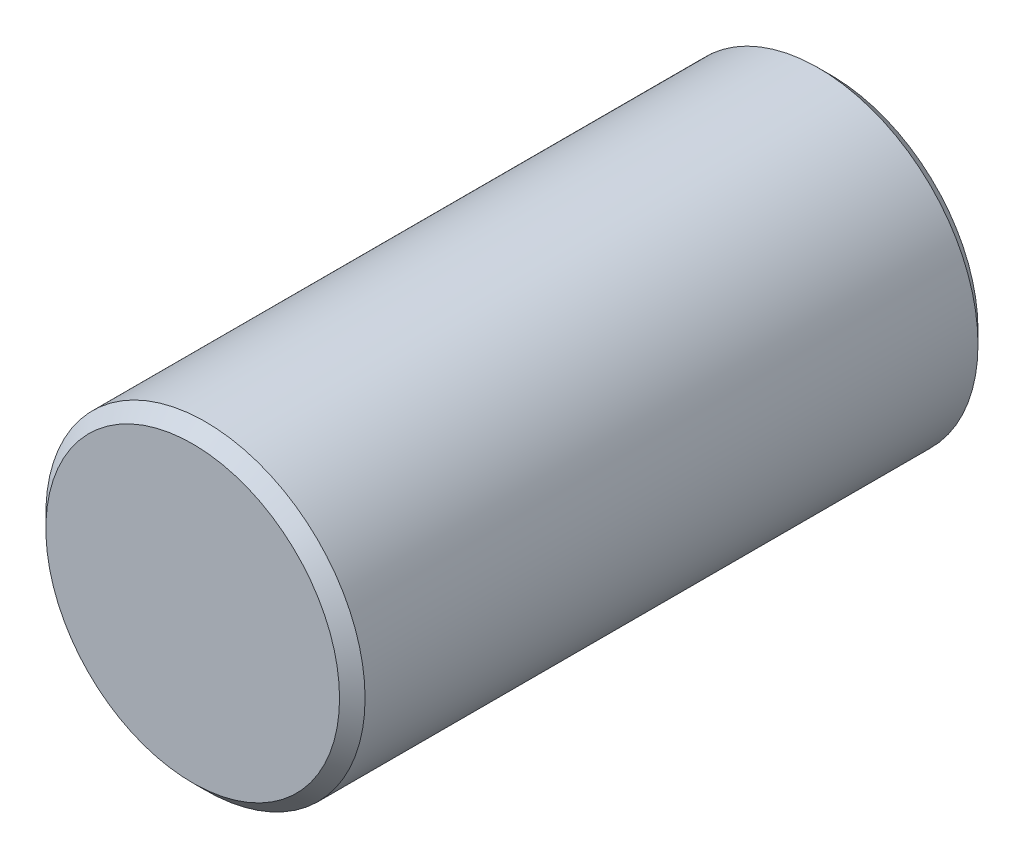
ISO-10303-21;
HEADER;
FILE_DESCRIPTION(('STEP AP214'),'2;1');
FILE_NAME('part.step','',(''),(''),'','','');
FILE_SCHEMA(('AUTOMOTIVE_DESIGN { 1 0 10303 214 1 1 1 1 }'));
ENDSEC;
DATA;
#1=APPLICATION_CONTEXT('core data for automotive mechanical design processes');
#2=APPLICATION_PROTOCOL_DEFINITION('international standard','automotive_design',2000,#1);
#3=PRODUCT_CONTEXT('',#1,'mechanical');
#4=PRODUCT('Part','Part','',(#3));
#5=PRODUCT_RELATED_PRODUCT_CATEGORY('part','',(#4));
#6=PRODUCT_DEFINITION_FORMATION('','',#4);
#7=PRODUCT_DEFINITION_CONTEXT('part definition',#1,'design');
#8=PRODUCT_DEFINITION('design','',#6,#7);
#9=PRODUCT_DEFINITION_SHAPE('','',#8);
#10=(LENGTH_UNIT() NAMED_UNIT(*) SI_UNIT(.MILLI.,.METRE.));
#11=(NAMED_UNIT(*) PLANE_ANGLE_UNIT() SI_UNIT($,.RADIAN.));
#12=(NAMED_UNIT(*) SI_UNIT($,.STERADIAN.) SOLID_ANGLE_UNIT());
#13=UNCERTAINTY_MEASURE_WITH_UNIT(LENGTH_MEASURE(1.E-05),#10,'distance_accuracy_value','');
#14=(GEOMETRIC_REPRESENTATION_CONTEXT(3) GLOBAL_UNCERTAINTY_ASSIGNED_CONTEXT((#13)) GLOBAL_UNIT_ASSIGNED_CONTEXT((#10,
#11,#12)) REPRESENTATION_CONTEXT('',''));
#15=CARTESIAN_POINT('',(0.,0.,0.));
#16=DIRECTION('',(0.,0.,1.));
#17=DIRECTION('',(1.,0.,0.));
#18=AXIS2_PLACEMENT_3D('',#15,#16,#17);
#19=CARTESIAN_POINT('',(0.,0.,2.5));
#20=DIRECTION('',(0.,0.,-1.));
#21=DIRECTION('',(-1.,0.,0.));
#22=AXIS2_PLACEMENT_3D('',#19,#20,#21);
#23=CYLINDRICAL_SURFACE('',#22,1.25);
#24=CARTESIAN_POINT('',(0.,0.,-2.4));
#25=DIRECTION('',(0.,0.,1.));
#26=DIRECTION('',(1.,0.,0.));
#27=AXIS2_PLACEMENT_3D('',#24,#25,#26);
#28=CIRCLE('',#27,1.25);
#29=CARTESIAN_POINT('',(1.25,0.,-2.4));
#30=VERTEX_POINT('',#29);
#31=EDGE_CURVE('E45',#30,#30,#28,.T.);
#32=ORIENTED_EDGE('',*,*,#31,.T.);
#33=EDGE_LOOP('',(#32));
#34=FACE_BOUND('',#33,.T.);
#35=CARTESIAN_POINT('',(0.,0.,2.4));
#36=DIRECTION('',(0.,0.,1.));
#37=DIRECTION('',(1.,0.,0.));
#38=AXIS2_PLACEMENT_3D('',#35,#36,#37);
#39=CIRCLE('',#38,1.25);
#40=CARTESIAN_POINT('',(1.25,0.,2.4));
#41=VERTEX_POINT('',#40);
#42=EDGE_CURVE('E49',#41,#41,#39,.F.);
#43=ORIENTED_EDGE('',*,*,#42,.T.);
#44=EDGE_LOOP('',(#43));
#45=FACE_BOUND('',#44,.T.);
#46=ADVANCED_FACE('F33',(#34,#45),#23,.T.);
#47=CARTESIAN_POINT('',(0.,0.,2.5));
#48=DIRECTION('',(0.,0.,1.));
#49=DIRECTION('',(1.,0.,0.));
#50=AXIS2_PLACEMENT_3D('',#47,#48,#49);
#51=PLANE('',#50);
#52=CARTESIAN_POINT('',(0.,0.,2.5));
#53=DIRECTION('',(0.,0.,1.));
#54=DIRECTION('',(1.,0.,0.));
#55=AXIS2_PLACEMENT_3D('',#52,#53,#54);
#56=CIRCLE('',#55,1.15);
#57=CARTESIAN_POINT('',(1.15,0.,2.5));
#58=VERTEX_POINT('',#57);
#59=EDGE_CURVE('E10',#58,#58,#56,.T.);
#60=ORIENTED_EDGE('',*,*,#59,.T.);
#61=EDGE_LOOP('',(#60));
#62=FACE_BOUND('',#61,.T.);
#63=ADVANCED_FACE('F65',(#62),#51,.T.);
#64=CARTESIAN_POINT('',(0.,0.,-2.5));
#65=DIRECTION('',(0.,0.,1.));
#66=DIRECTION('',(1.,0.,0.));
#67=AXIS2_PLACEMENT_3D('',#64,#65,#66);
#68=PLANE('',#67);
#69=CARTESIAN_POINT('',(0.,0.,-2.5));
#70=DIRECTION('',(0.,0.,1.));
#71=DIRECTION('',(1.,0.,0.));
#72=AXIS2_PLACEMENT_3D('',#69,#70,#71);
#73=CIRCLE('',#72,1.15);
#74=CARTESIAN_POINT('',(1.15,0.,-2.5));
#75=VERTEX_POINT('',#74);
#76=EDGE_CURVE('E41',#75,#75,#73,.F.);
#77=ORIENTED_EDGE('',*,*,#76,.T.);
#78=EDGE_LOOP('',(#77));
#79=FACE_BOUND('',#78,.T.);
#80=ADVANCED_FACE('F62',(#79),#68,.F.);
#81=CARTESIAN_POINT('',(0.,0.,-2.4));
#82=DIRECTION('',(0.,0.,1.));
#83=DIRECTION('',(1.,0.,0.));
#84=AXIS2_PLACEMENT_3D('',#81,#82,#83);
#85=CONICAL_SURFACE('',#84,1.25,0.785398163397456);
#86=ORIENTED_EDGE('',*,*,#76,.F.);
#87=EDGE_LOOP('',(#86));
#88=FACE_BOUND('',#87,.T.);
#89=ORIENTED_EDGE('',*,*,#31,.F.);
#90=EDGE_LOOP('',(#89));
#91=FACE_BOUND('',#90,.T.);
#92=ADVANCED_FACE('F58',(#88,#91),#85,.T.);
#93=CARTESIAN_POINT('',(0.,0.,2.5));
#94=DIRECTION('',(0.,0.,-1.));
#95=DIRECTION('',(-1.,0.,0.));
#96=AXIS2_PLACEMENT_3D('',#93,#94,#95);
#97=CONICAL_SURFACE('',#96,1.15,0.785398163397449);
#98=ORIENTED_EDGE('',*,*,#42,.F.);
#99=EDGE_LOOP('',(#98));
#100=FACE_BOUND('',#99,.T.);
#101=ORIENTED_EDGE('',*,*,#59,.F.);
#102=EDGE_LOOP('',(#101));
#103=FACE_BOUND('',#102,.T.);
#104=ADVANCED_FACE('F36',(#100,#103),#97,.T.);
#105=CLOSED_SHELL('',(#46,#63,#80,#92,#104));
#106=MANIFOLD_SOLID_BREP('B2',#105);
#107=ADVANCED_BREP_SHAPE_REPRESENTATION('',(#18,#106),#14);
#108=SHAPE_DEFINITION_REPRESENTATION(#9,#107);
ENDSEC;
END-ISO-10303-21;
